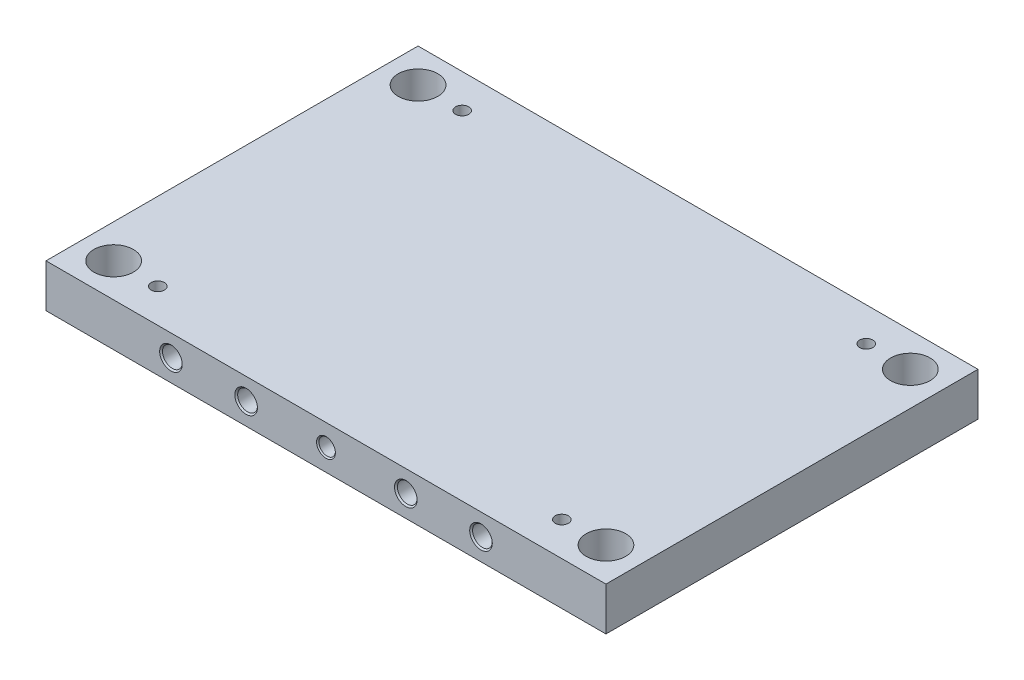
ISO-10303-21;
HEADER;
FILE_DESCRIPTION(('STEP AP214'),'2;1');
FILE_NAME('part.step','',(''),(''),'','','');
FILE_SCHEMA(('AUTOMOTIVE_DESIGN { 1 0 10303 214 1 1 1 1 }'));
ENDSEC;
DATA;
#1=APPLICATION_CONTEXT('core data for automotive mechanical design processes');
#2=APPLICATION_PROTOCOL_DEFINITION('international standard','automotive_design',2000,#1);
#3=PRODUCT_CONTEXT('',#1,'mechanical');
#4=PRODUCT('Part','Part','',(#3));
#5=PRODUCT_RELATED_PRODUCT_CATEGORY('part','',(#4));
#6=PRODUCT_DEFINITION_FORMATION('','',#4);
#7=PRODUCT_DEFINITION_CONTEXT('part definition',#1,'design');
#8=PRODUCT_DEFINITION('design','',#6,#7);
#9=PRODUCT_DEFINITION_SHAPE('','',#8);
#10=(LENGTH_UNIT() NAMED_UNIT(*) SI_UNIT(.MILLI.,.METRE.));
#11=(NAMED_UNIT(*) PLANE_ANGLE_UNIT() SI_UNIT($,.RADIAN.));
#12=(NAMED_UNIT(*) SI_UNIT($,.STERADIAN.) SOLID_ANGLE_UNIT());
#13=UNCERTAINTY_MEASURE_WITH_UNIT(LENGTH_MEASURE(1.E-05),#10,'distance_accuracy_value','');
#14=(GEOMETRIC_REPRESENTATION_CONTEXT(3) GLOBAL_UNCERTAINTY_ASSIGNED_CONTEXT((#13)) GLOBAL_UNIT_ASSIGNED_CONTEXT((#10,
#11,#12)) REPRESENTATION_CONTEXT('',''));
#15=CARTESIAN_POINT('',(0.,0.,0.));
#16=DIRECTION('',(0.,0.,1.));
#17=DIRECTION('',(1.,0.,0.));
#18=AXIS2_PLACEMENT_3D('',#15,#16,#17);
#19=CARTESIAN_POINT('',(0.,-46.,-396.));
#20=DIRECTION('',(0.,0.,1.));
#21=DIRECTION('',(1.,0.,0.));
#22=AXIS2_PLACEMENT_3D('',#19,#20,#21);
#23=PLANE('',#22);
#24=CARTESIAN_POINT('',(133.,-23.,-396.));
#25=DIRECTION('',(0.,0.,-1.));
#26=DIRECTION('',(-1.,0.,0.));
#27=AXIS2_PLACEMENT_3D('',#24,#25,#26);
#28=CIRCLE('',#27,12.025);
#29=CARTESIAN_POINT('',(120.975,-23.,-396.));
#30=VERTEX_POINT('',#29);
#31=EDGE_CURVE('E116',#30,#30,#28,.T.);
#32=ORIENTED_EDGE('',*,*,#31,.F.);
#33=EDGE_LOOP('',(#32));
#34=FACE_BOUND('',#33,.T.);
#35=CARTESIAN_POINT('',(463.,-23.,-396.));
#36=DIRECTION('',(0.,0.,-1.));
#37=DIRECTION('',(-1.,0.,0.));
#38=AXIS2_PLACEMENT_3D('',#35,#36,#37);
#39=CIRCLE('',#38,12.025);
#40=CARTESIAN_POINT('',(450.975,-23.,-396.));
#41=VERTEX_POINT('',#40);
#42=EDGE_CURVE('E136',#41,#41,#39,.T.);
#43=ORIENTED_EDGE('',*,*,#42,.F.);
#44=EDGE_LOOP('',(#43));
#45=FACE_BOUND('',#44,.T.);
#46=DIRECTION('',(1.,0.,0.));
#47=VECTOR('',#46,1.);
#48=CARTESIAN_POINT('',(0.,0.,-396.));
#49=LINE('',#48,#47);
#50=CARTESIAN_POINT('',(0.,0.,-396.));
#51=VERTEX_POINT('',#50);
#52=CARTESIAN_POINT('',(596.,0.,-396.));
#53=VERTEX_POINT('',#52);
#54=EDGE_CURVE('E74',#51,#53,#49,.T.);
#55=ORIENTED_EDGE('',*,*,#54,.T.);
#56=DIRECTION('',(0.,1.,0.));
#57=VECTOR('',#56,1.);
#58=CARTESIAN_POINT('',(596.,-46.,-396.));
#59=LINE('',#58,#57);
#60=CARTESIAN_POINT('',(596.,-46.,-396.));
#61=VERTEX_POINT('',#60);
#62=EDGE_CURVE('E252',#61,#53,#59,.T.);
#63=ORIENTED_EDGE('',*,*,#62,.F.);
#64=DIRECTION('',(1.,0.,0.));
#65=VECTOR('',#64,1.);
#66=CARTESIAN_POINT('',(0.,-46.,-396.));
#67=LINE('',#66,#65);
#68=CARTESIAN_POINT('',(0.,-46.,-396.));
#69=VERTEX_POINT('',#68);
#70=EDGE_CURVE('E219',#69,#61,#67,.T.);
#71=ORIENTED_EDGE('',*,*,#70,.F.);
#72=DIRECTION('',(0.,1.,0.));
#73=VECTOR('',#72,1.);
#74=CARTESIAN_POINT('',(0.,-46.,-396.));
#75=LINE('',#74,#73);
#76=EDGE_CURVE('E48',#69,#51,#75,.T.);
#77=ORIENTED_EDGE('',*,*,#76,.T.);
#78=EDGE_LOOP('',(#55,#63,#71,#77));
#79=FACE_BOUND('',#78,.T.);
#80=CARTESIAN_POINT('',(383.,-23.,-396.));
#81=DIRECTION('',(0.,0.,-1.));
#82=DIRECTION('',(-1.,0.,0.));
#83=AXIS2_PLACEMENT_3D('',#80,#81,#82);
#84=CIRCLE('',#83,12.025);
#85=CARTESIAN_POINT('',(370.975,-23.,-396.));
#86=VERTEX_POINT('',#85);
#87=EDGE_CURVE('E126',#86,#86,#84,.T.);
#88=ORIENTED_EDGE('',*,*,#87,.F.);
#89=EDGE_LOOP('',(#88));
#90=FACE_BOUND('',#89,.T.);
#91=CARTESIAN_POINT('',(213.,-23.,-396.));
#92=DIRECTION('',(0.,0.,-1.));
#93=DIRECTION('',(-1.,0.,0.));
#94=AXIS2_PLACEMENT_3D('',#91,#92,#93);
#95=CIRCLE('',#94,12.025);
#96=CARTESIAN_POINT('',(200.975,-23.,-396.));
#97=VERTEX_POINT('',#96);
#98=EDGE_CURVE('E100',#97,#97,#95,.T.);
#99=ORIENTED_EDGE('',*,*,#98,.F.);
#100=EDGE_LOOP('',(#99));
#101=FACE_BOUND('',#100,.T.);
#102=ADVANCED_FACE('F38',(#34,#45,#79,#90,#101),#23,.F.);
#103=CARTESIAN_POINT('',(0.,-46.,0.));
#104=DIRECTION('',(0.,0.,1.));
#105=DIRECTION('',(1.,0.,0.));
#106=AXIS2_PLACEMENT_3D('',#103,#104,#105);
#107=PLANE('',#106);
#108=CARTESIAN_POINT('',(298.,-23.,0.));
#109=DIRECTION('',(0.,0.,1.));
#110=DIRECTION('',(1.,0.,0.));
#111=AXIS2_PLACEMENT_3D('',#108,#109,#110);
#112=CIRCLE('',#111,10.025);
#113=CARTESIAN_POINT('',(308.025,-23.,0.));
#114=VERTEX_POINT('',#113);
#115=EDGE_CURVE('E107',#114,#114,#112,.T.);
#116=ORIENTED_EDGE('',*,*,#115,.F.);
#117=EDGE_LOOP('',(#116));
#118=FACE_BOUND('',#117,.T.);
#119=CARTESIAN_POINT('',(213.,-23.,0.));
#120=DIRECTION('',(0.,0.,1.));
#121=DIRECTION('',(1.,0.,0.));
#122=AXIS2_PLACEMENT_3D('',#119,#120,#121);
#123=CIRCLE('',#122,12.025);
#124=CARTESIAN_POINT('',(225.025,-23.,0.));
#125=VERTEX_POINT('',#124);
#126=EDGE_CURVE('E146',#125,#125,#123,.T.);
#127=ORIENTED_EDGE('',*,*,#126,.F.);
#128=EDGE_LOOP('',(#127));
#129=FACE_BOUND('',#128,.T.);
#130=CARTESIAN_POINT('',(133.,-23.,0.));
#131=DIRECTION('',(0.,0.,1.));
#132=DIRECTION('',(1.,0.,0.));
#133=AXIS2_PLACEMENT_3D('',#130,#131,#132);
#134=CIRCLE('',#133,12.025);
#135=CARTESIAN_POINT('',(145.025,-23.,0.));
#136=VERTEX_POINT('',#135);
#137=EDGE_CURVE('E156',#136,#136,#134,.T.);
#138=ORIENTED_EDGE('',*,*,#137,.F.);
#139=EDGE_LOOP('',(#138));
#140=FACE_BOUND('',#139,.T.);
#141=CARTESIAN_POINT('',(383.,-23.,0.));
#142=DIRECTION('',(0.,0.,1.));
#143=DIRECTION('',(1.,0.,0.));
#144=AXIS2_PLACEMENT_3D('',#141,#142,#143);
#145=CIRCLE('',#144,12.025);
#146=CARTESIAN_POINT('',(395.025,-23.,0.));
#147=VERTEX_POINT('',#146);
#148=EDGE_CURVE('E166',#147,#147,#145,.T.);
#149=ORIENTED_EDGE('',*,*,#148,.F.);
#150=EDGE_LOOP('',(#149));
#151=FACE_BOUND('',#150,.T.);
#152=CARTESIAN_POINT('',(463.,-23.,0.));
#153=DIRECTION('',(0.,0.,1.));
#154=DIRECTION('',(1.,0.,0.));
#155=AXIS2_PLACEMENT_3D('',#152,#153,#154);
#156=CIRCLE('',#155,12.025);
#157=CARTESIAN_POINT('',(475.025,-23.,0.));
#158=VERTEX_POINT('',#157);
#159=EDGE_CURVE('E176',#158,#158,#156,.T.);
#160=ORIENTED_EDGE('',*,*,#159,.F.);
#161=EDGE_LOOP('',(#160));
#162=FACE_BOUND('',#161,.T.);
#163=DIRECTION('',(1.,0.,0.));
#164=VECTOR('',#163,1.);
#165=CARTESIAN_POINT('',(0.,0.,0.));
#166=LINE('',#165,#164);
#167=CARTESIAN_POINT('',(0.,0.,0.));
#168=VERTEX_POINT('',#167);
#169=CARTESIAN_POINT('',(596.,0.,0.));
#170=VERTEX_POINT('',#169);
#171=EDGE_CURVE('E235',#168,#170,#166,.T.);
#172=ORIENTED_EDGE('',*,*,#171,.F.);
#173=DIRECTION('',(0.,1.,0.));
#174=VECTOR('',#173,1.);
#175=CARTESIAN_POINT('',(0.,-46.,0.));
#176=LINE('',#175,#174);
#177=CARTESIAN_POINT('',(0.,-46.,0.));
#178=VERTEX_POINT('',#177);
#179=EDGE_CURVE('E11',#178,#168,#176,.T.);
#180=ORIENTED_EDGE('',*,*,#179,.F.);
#181=DIRECTION('',(1.,0.,0.));
#182=VECTOR('',#181,1.);
#183=CARTESIAN_POINT('',(0.,-46.,0.));
#184=LINE('',#183,#182);
#185=CARTESIAN_POINT('',(596.,-46.,0.));
#186=VERTEX_POINT('',#185);
#187=EDGE_CURVE('E214',#178,#186,#184,.T.);
#188=ORIENTED_EDGE('',*,*,#187,.T.);
#189=DIRECTION('',(0.,1.,0.));
#190=VECTOR('',#189,1.);
#191=CARTESIAN_POINT('',(596.,-46.,0.));
#192=LINE('',#191,#190);
#193=EDGE_CURVE('E84',#186,#170,#192,.T.);
#194=ORIENTED_EDGE('',*,*,#193,.T.);
#195=EDGE_LOOP('',(#172,#180,#188,#194));
#196=FACE_BOUND('',#195,.T.);
#197=ADVANCED_FACE('F289',(#118,#129,#140,#151,#162,#196),#107,.T.);
#198=CARTESIAN_POINT('',(0.,-46.,0.));
#199=DIRECTION('',(1.,0.,0.));
#200=DIRECTION('',(0.,0.,-1.));
#201=AXIS2_PLACEMENT_3D('',#198,#199,#200);
#202=PLANE('',#201);
#203=DIRECTION('',(0.,0.,-1.));
#204=VECTOR('',#203,1.);
#205=CARTESIAN_POINT('',(0.,0.,0.));
#206=LINE('',#205,#204);
#207=EDGE_CURVE('E241',#168,#51,#206,.T.);
#208=ORIENTED_EDGE('',*,*,#207,.T.);
#209=ORIENTED_EDGE('',*,*,#76,.F.);
#210=DIRECTION('',(0.,0.,-1.));
#211=VECTOR('',#210,1.);
#212=CARTESIAN_POINT('',(0.,-46.,0.));
#213=LINE('',#212,#211);
#214=EDGE_CURVE('E221',#178,#69,#213,.T.);
#215=ORIENTED_EDGE('',*,*,#214,.F.);
#216=ORIENTED_EDGE('',*,*,#179,.T.);
#217=EDGE_LOOP('',(#208,#209,#215,#216));
#218=FACE_BOUND('',#217,.T.);
#219=ADVANCED_FACE('F295',(#218),#202,.F.);
#220=CARTESIAN_POINT('',(35.9999999999999,-46.,-360.));
#221=DIRECTION('',(0.,1.,0.));
#222=DIRECTION('',(0.,0.,1.));
#223=AXIS2_PLACEMENT_3D('',#220,#221,#222);
#224=CYLINDRICAL_SURFACE('',#223,21.);
#225=CARTESIAN_POINT('',(35.9999999999999,-46.,-360.));
#226=DIRECTION('',(0.,1.,0.));
#227=DIRECTION('',(0.,0.,1.));
#228=AXIS2_PLACEMENT_3D('',#225,#226,#227);
#229=CIRCLE('',#228,21.);
#230=CARTESIAN_POINT('',(35.9999999999999,-46.,-339.));
#231=VERTEX_POINT('',#230);
#232=EDGE_CURVE('E227',#231,#231,#229,.T.);
#233=ORIENTED_EDGE('',*,*,#232,.F.);
#234=EDGE_LOOP('',(#233));
#235=FACE_BOUND('',#234,.T.);
#236=CARTESIAN_POINT('',(35.9999999999999,0.,-360.));
#237=DIRECTION('',(0.,1.,0.));
#238=DIRECTION('',(0.,0.,1.));
#239=AXIS2_PLACEMENT_3D('',#236,#237,#238);
#240=CIRCLE('',#239,21.);
#241=CARTESIAN_POINT('',(35.9999999999999,0.,-339.));
#242=VERTEX_POINT('',#241);
#243=EDGE_CURVE('E246',#242,#242,#240,.T.);
#244=ORIENTED_EDGE('',*,*,#243,.T.);
#245=EDGE_LOOP('',(#244));
#246=FACE_BOUND('',#245,.T.);
#247=ADVANCED_FACE('F311',(#235,#246),#224,.F.);
#248=CARTESIAN_POINT('',(560.,-46.,-36.));
#249=DIRECTION('',(0.,1.,0.));
#250=DIRECTION('',(0.,0.,1.));
#251=AXIS2_PLACEMENT_3D('',#248,#249,#250);
#252=CYLINDRICAL_SURFACE('',#251,21.);
#253=CARTESIAN_POINT('',(560.,-46.,-36.));
#254=DIRECTION('',(0.,1.,0.));
#255=DIRECTION('',(0.,0.,1.));
#256=AXIS2_PLACEMENT_3D('',#253,#254,#255);
#257=CIRCLE('',#256,21.);
#258=CARTESIAN_POINT('',(560.,-46.,-15.));
#259=VERTEX_POINT('',#258);
#260=EDGE_CURVE('E224',#259,#259,#257,.T.);
#261=ORIENTED_EDGE('',*,*,#260,.F.);
#262=EDGE_LOOP('',(#261));
#263=FACE_BOUND('',#262,.T.);
#264=CARTESIAN_POINT('',(560.,0.,-36.));
#265=DIRECTION('',(0.,1.,0.));
#266=DIRECTION('',(0.,0.,1.));
#267=AXIS2_PLACEMENT_3D('',#264,#265,#266);
#268=CIRCLE('',#267,21.);
#269=CARTESIAN_POINT('',(560.,0.,-15.));
#270=VERTEX_POINT('',#269);
#271=EDGE_CURVE('E243',#270,#270,#268,.T.);
#272=ORIENTED_EDGE('',*,*,#271,.T.);
#273=EDGE_LOOP('',(#272));
#274=FACE_BOUND('',#273,.T.);
#275=ADVANCED_FACE('F304',(#263,#274),#252,.F.);
#276=CARTESIAN_POINT('',(596.,-46.,0.));
#277=DIRECTION('',(1.,0.,0.));
#278=DIRECTION('',(0.,0.,-1.));
#279=AXIS2_PLACEMENT_3D('',#276,#277,#278);
#280=PLANE('',#279);
#281=DIRECTION('',(0.,0.,-1.));
#282=VECTOR('',#281,1.);
#283=CARTESIAN_POINT('',(596.,0.,0.));
#284=LINE('',#283,#282);
#285=EDGE_CURVE('E238',#170,#53,#284,.T.);
#286=ORIENTED_EDGE('',*,*,#285,.F.);
#287=ORIENTED_EDGE('',*,*,#193,.F.);
#288=DIRECTION('',(0.,0.,-1.));
#289=VECTOR('',#288,1.);
#290=CARTESIAN_POINT('',(596.,-46.,0.));
#291=LINE('',#290,#289);
#292=EDGE_CURVE('E217',#186,#61,#291,.T.);
#293=ORIENTED_EDGE('',*,*,#292,.T.);
#294=ORIENTED_EDGE('',*,*,#62,.T.);
#295=EDGE_LOOP('',(#286,#287,#293,#294));
#296=FACE_BOUND('',#295,.T.);
#297=ADVANCED_FACE('F302',(#296),#280,.T.);
#298=CARTESIAN_POINT('',(35.9999999999999,-46.,-36.));
#299=DIRECTION('',(0.,1.,0.));
#300=DIRECTION('',(0.,0.,1.));
#301=AXIS2_PLACEMENT_3D('',#298,#299,#300);
#302=CYLINDRICAL_SURFACE('',#301,21.);
#303=CARTESIAN_POINT('',(35.9999999999999,-46.,-36.));
#304=DIRECTION('',(0.,1.,0.));
#305=DIRECTION('',(0.,0.,1.));
#306=AXIS2_PLACEMENT_3D('',#303,#304,#305);
#307=CIRCLE('',#306,21.);
#308=CARTESIAN_POINT('',(35.9999999999999,-46.,-15.));
#309=VERTEX_POINT('',#308);
#310=EDGE_CURVE('E211',#309,#309,#307,.F.);
#311=ORIENTED_EDGE('',*,*,#310,.T.);
#312=EDGE_LOOP('',(#311));
#313=FACE_BOUND('',#312,.T.);
#314=CARTESIAN_POINT('',(35.9999999999999,0.,-36.));
#315=DIRECTION('',(0.,1.,0.));
#316=DIRECTION('',(0.,0.,1.));
#317=AXIS2_PLACEMENT_3D('',#314,#315,#316);
#318=CIRCLE('',#317,21.);
#319=CARTESIAN_POINT('',(35.9999999999999,0.,-15.));
#320=VERTEX_POINT('',#319);
#321=EDGE_CURVE('E210',#320,#320,#318,.F.);
#322=ORIENTED_EDGE('',*,*,#321,.F.);
#323=EDGE_LOOP('',(#322));
#324=FACE_BOUND('',#323,.T.);
#325=ADVANCED_FACE('F40',(#313,#324),#302,.F.);
#326=CARTESIAN_POINT('',(560.,-46.,-360.));
#327=DIRECTION('',(0.,1.,0.));
#328=DIRECTION('',(0.,0.,1.));
#329=AXIS2_PLACEMENT_3D('',#326,#327,#328);
#330=CYLINDRICAL_SURFACE('',#329,21.);
#331=CARTESIAN_POINT('',(560.,-46.,-360.));
#332=DIRECTION('',(0.,1.,0.));
#333=DIRECTION('',(0.,0.,1.));
#334=AXIS2_PLACEMENT_3D('',#331,#332,#333);
#335=CIRCLE('',#334,21.);
#336=CARTESIAN_POINT('',(560.,-46.,-339.));
#337=VERTEX_POINT('',#336);
#338=EDGE_CURVE('E230',#337,#337,#335,.F.);
#339=ORIENTED_EDGE('',*,*,#338,.T.);
#340=EDGE_LOOP('',(#339));
#341=FACE_BOUND('',#340,.T.);
#342=CARTESIAN_POINT('',(560.,0.,-360.));
#343=DIRECTION('',(0.,1.,0.));
#344=DIRECTION('',(0.,0.,1.));
#345=AXIS2_PLACEMENT_3D('',#342,#343,#344);
#346=CIRCLE('',#345,21.);
#347=CARTESIAN_POINT('',(560.,0.,-339.));
#348=VERTEX_POINT('',#347);
#349=EDGE_CURVE('E215',#348,#348,#346,.F.);
#350=ORIENTED_EDGE('',*,*,#349,.F.);
#351=EDGE_LOOP('',(#350));
#352=FACE_BOUND('',#351,.T.);
#353=ADVANCED_FACE('F309',(#341,#352),#330,.F.);
#354=CARTESIAN_POINT('',(0.,-46.,0.));
#355=DIRECTION('',(0.,1.,0.));
#356=DIRECTION('',(0.,0.,1.));
#357=AXIS2_PLACEMENT_3D('',#354,#355,#356);
#358=PLANE('',#357);
#359=CARTESIAN_POINT('',(83.,-46.,-360.));
#360=DIRECTION('',(0.,1.,0.));
#361=DIRECTION('',(0.,0.,1.));
#362=AXIS2_PLACEMENT_3D('',#359,#360,#361);
#363=CIRCLE('',#362,6.99999999999999);
#364=CARTESIAN_POINT('',(83.,-46.,-353.));
#365=VERTEX_POINT('',#364);
#366=EDGE_CURVE('E189',#365,#365,#363,.T.);
#367=ORIENTED_EDGE('',*,*,#366,.T.);
#368=EDGE_LOOP('',(#367));
#369=FACE_BOUND('',#368,.T.);
#370=CARTESIAN_POINT('',(513.,-46.,-360.));
#371=DIRECTION('',(0.,1.,0.));
#372=DIRECTION('',(0.,0.,1.));
#373=AXIS2_PLACEMENT_3D('',#370,#371,#372);
#374=CIRCLE('',#373,7.00000000000001);
#375=CARTESIAN_POINT('',(513.,-46.,-353.));
#376=VERTEX_POINT('',#375);
#377=EDGE_CURVE('E195',#376,#376,#374,.T.);
#378=ORIENTED_EDGE('',*,*,#377,.T.);
#379=EDGE_LOOP('',(#378));
#380=FACE_BOUND('',#379,.T.);
#381=CARTESIAN_POINT('',(83.,-46.,-36.));
#382=DIRECTION('',(0.,1.,0.));
#383=DIRECTION('',(0.,0.,1.));
#384=AXIS2_PLACEMENT_3D('',#381,#382,#383);
#385=CIRCLE('',#384,6.99999999999999);
#386=CARTESIAN_POINT('',(83.,-46.,-29.));
#387=VERTEX_POINT('',#386);
#388=EDGE_CURVE('E201',#387,#387,#385,.T.);
#389=ORIENTED_EDGE('',*,*,#388,.T.);
#390=EDGE_LOOP('',(#389));
#391=FACE_BOUND('',#390,.T.);
#392=CARTESIAN_POINT('',(513.,-46.,-36.));
#393=DIRECTION('',(0.,1.,0.));
#394=DIRECTION('',(0.,0.,1.));
#395=AXIS2_PLACEMENT_3D('',#392,#393,#394);
#396=CIRCLE('',#395,7.00000000000001);
#397=CARTESIAN_POINT('',(513.,-46.,-29.));
#398=VERTEX_POINT('',#397);
#399=EDGE_CURVE('E207',#398,#398,#396,.T.);
#400=ORIENTED_EDGE('',*,*,#399,.T.);
#401=EDGE_LOOP('',(#400));
#402=FACE_BOUND('',#401,.T.);
#403=ORIENTED_EDGE('',*,*,#310,.F.);
#404=EDGE_LOOP('',(#403));
#405=FACE_BOUND('',#404,.T.);
#406=ORIENTED_EDGE('',*,*,#187,.F.);
#407=ORIENTED_EDGE('',*,*,#214,.T.);
#408=ORIENTED_EDGE('',*,*,#70,.T.);
#409=ORIENTED_EDGE('',*,*,#292,.F.);
#410=EDGE_LOOP('',(#406,#407,#408,#409));
#411=FACE_BOUND('',#410,.T.);
#412=ORIENTED_EDGE('',*,*,#260,.T.);
#413=EDGE_LOOP('',(#412));
#414=FACE_BOUND('',#413,.T.);
#415=ORIENTED_EDGE('',*,*,#232,.T.);
#416=EDGE_LOOP('',(#415));
#417=FACE_BOUND('',#416,.T.);
#418=ORIENTED_EDGE('',*,*,#338,.F.);
#419=EDGE_LOOP('',(#418));
#420=FACE_BOUND('',#419,.T.);
#421=ADVANCED_FACE('F318',(#369,#380,#391,#402,#405,#411,#414,#417,#420),#358,.F.);
#422=CARTESIAN_POINT('',(0.,0.,0.));
#423=DIRECTION('',(0.,1.,0.));
#424=DIRECTION('',(0.,0.,1.));
#425=AXIS2_PLACEMENT_3D('',#422,#423,#424);
#426=PLANE('',#425);
#427=CARTESIAN_POINT('',(83.,0.,-360.));
#428=DIRECTION('',(0.,1.,0.));
#429=DIRECTION('',(0.,0.,1.));
#430=AXIS2_PLACEMENT_3D('',#427,#428,#429);
#431=CIRCLE('',#430,6.99999999999999);
#432=CARTESIAN_POINT('',(83.,0.,-353.));
#433=VERTEX_POINT('',#432);
#434=EDGE_CURVE('E186',#433,#433,#431,.T.);
#435=ORIENTED_EDGE('',*,*,#434,.F.);
#436=EDGE_LOOP('',(#435));
#437=FACE_BOUND('',#436,.T.);
#438=CARTESIAN_POINT('',(513.,0.,-360.));
#439=DIRECTION('',(0.,1.,0.));
#440=DIRECTION('',(0.,0.,1.));
#441=AXIS2_PLACEMENT_3D('',#438,#439,#440);
#442=CIRCLE('',#441,7.00000000000001);
#443=CARTESIAN_POINT('',(513.,0.,-353.));
#444=VERTEX_POINT('',#443);
#445=EDGE_CURVE('E192',#444,#444,#442,.T.);
#446=ORIENTED_EDGE('',*,*,#445,.F.);
#447=EDGE_LOOP('',(#446));
#448=FACE_BOUND('',#447,.T.);
#449=CARTESIAN_POINT('',(83.,0.,-36.));
#450=DIRECTION('',(0.,1.,0.));
#451=DIRECTION('',(0.,0.,1.));
#452=AXIS2_PLACEMENT_3D('',#449,#450,#451);
#453=CIRCLE('',#452,6.99999999999999);
#454=CARTESIAN_POINT('',(83.,0.,-29.));
#455=VERTEX_POINT('',#454);
#456=EDGE_CURVE('E198',#455,#455,#453,.T.);
#457=ORIENTED_EDGE('',*,*,#456,.F.);
#458=EDGE_LOOP('',(#457));
#459=FACE_BOUND('',#458,.T.);
#460=CARTESIAN_POINT('',(513.,0.,-36.));
#461=DIRECTION('',(0.,1.,0.));
#462=DIRECTION('',(0.,0.,1.));
#463=AXIS2_PLACEMENT_3D('',#460,#461,#462);
#464=CIRCLE('',#463,7.00000000000001);
#465=CARTESIAN_POINT('',(513.,0.,-29.));
#466=VERTEX_POINT('',#465);
#467=EDGE_CURVE('E204',#466,#466,#464,.T.);
#468=ORIENTED_EDGE('',*,*,#467,.F.);
#469=EDGE_LOOP('',(#468));
#470=FACE_BOUND('',#469,.T.);
#471=ORIENTED_EDGE('',*,*,#321,.T.);
#472=EDGE_LOOP('',(#471));
#473=FACE_BOUND('',#472,.T.);
#474=ORIENTED_EDGE('',*,*,#171,.T.);
#475=ORIENTED_EDGE('',*,*,#285,.T.);
#476=ORIENTED_EDGE('',*,*,#54,.F.);
#477=ORIENTED_EDGE('',*,*,#207,.F.);
#478=EDGE_LOOP('',(#474,#475,#476,#477));
#479=FACE_BOUND('',#478,.T.);
#480=ORIENTED_EDGE('',*,*,#271,.F.);
#481=EDGE_LOOP('',(#480));
#482=FACE_BOUND('',#481,.T.);
#483=ORIENTED_EDGE('',*,*,#243,.F.);
#484=EDGE_LOOP('',(#483));
#485=FACE_BOUND('',#484,.T.);
#486=ORIENTED_EDGE('',*,*,#349,.T.);
#487=EDGE_LOOP('',(#486));
#488=FACE_BOUND('',#487,.T.);
#489=ADVANCED_FACE('F314',(#437,#448,#459,#470,#473,#479,#482,#485,#488),#426,.T.);
#490=CARTESIAN_POINT('',(513.,0.,-36.));
#491=DIRECTION('',(0.,1.,0.));
#492=DIRECTION('',(0.,0.,1.));
#493=AXIS2_PLACEMENT_3D('',#490,#491,#492);
#494=CYLINDRICAL_SURFACE('',#493,7.00000000000001);
#495=ORIENTED_EDGE('',*,*,#399,.F.);
#496=EDGE_LOOP('',(#495));
#497=FACE_BOUND('',#496,.T.);
#498=ORIENTED_EDGE('',*,*,#467,.T.);
#499=EDGE_LOOP('',(#498));
#500=FACE_BOUND('',#499,.T.);
#501=ADVANCED_FACE('F339',(#497,#500),#494,.F.);
#502=CARTESIAN_POINT('',(83.,0.,-36.));
#503=DIRECTION('',(0.,1.,0.));
#504=DIRECTION('',(0.,0.,1.));
#505=AXIS2_PLACEMENT_3D('',#502,#503,#504);
#506=CYLINDRICAL_SURFACE('',#505,6.99999999999999);
#507=ORIENTED_EDGE('',*,*,#388,.F.);
#508=EDGE_LOOP('',(#507));
#509=FACE_BOUND('',#508,.T.);
#510=ORIENTED_EDGE('',*,*,#456,.T.);
#511=EDGE_LOOP('',(#510));
#512=FACE_BOUND('',#511,.T.);
#513=ADVANCED_FACE('F346',(#509,#512),#506,.F.);
#514=CARTESIAN_POINT('',(513.,0.,-360.));
#515=DIRECTION('',(0.,1.,0.));
#516=DIRECTION('',(0.,0.,1.));
#517=AXIS2_PLACEMENT_3D('',#514,#515,#516);
#518=CYLINDRICAL_SURFACE('',#517,7.00000000000001);
#519=ORIENTED_EDGE('',*,*,#377,.F.);
#520=EDGE_LOOP('',(#519));
#521=FACE_BOUND('',#520,.T.);
#522=ORIENTED_EDGE('',*,*,#445,.T.);
#523=EDGE_LOOP('',(#522));
#524=FACE_BOUND('',#523,.T.);
#525=ADVANCED_FACE('F350',(#521,#524),#518,.F.);
#526=CARTESIAN_POINT('',(83.,0.,-360.));
#527=DIRECTION('',(0.,1.,0.));
#528=DIRECTION('',(0.,0.,1.));
#529=AXIS2_PLACEMENT_3D('',#526,#527,#528);
#530=CYLINDRICAL_SURFACE('',#529,6.99999999999999);
#531=ORIENTED_EDGE('',*,*,#366,.F.);
#532=EDGE_LOOP('',(#531));
#533=FACE_BOUND('',#532,.T.);
#534=ORIENTED_EDGE('',*,*,#434,.T.);
#535=EDGE_LOOP('',(#534));
#536=FACE_BOUND('',#535,.T.);
#537=ADVANCED_FACE('F354',(#533,#536),#530,.F.);
#538=CARTESIAN_POINT('',(133.,-23.,-396.));
#539=DIRECTION('',(0.,0.,1.));
#540=DIRECTION('',(1.,0.,0.));
#541=AXIS2_PLACEMENT_3D('',#538,#539,#540);
#542=CYLINDRICAL_SURFACE('',#541,5.00000000000002);
#543=CARTESIAN_POINT('',(133.,-23.,-357.695266595348));
#544=DIRECTION('',(0.,0.,-1.));
#545=DIRECTION('',(-1.,0.,0.));
#546=AXIS2_PLACEMENT_3D('',#543,#544,#545);
#547=CIRCLE('',#546,5.00000000000002);
#548=CARTESIAN_POINT('',(128.,-23.,-357.695266595348));
#549=VERTEX_POINT('',#548);
#550=EDGE_CURVE('E125',#549,#549,#547,.T.);
#551=ORIENTED_EDGE('',*,*,#550,.T.);
#552=EDGE_LOOP('',(#551));
#553=FACE_BOUND('',#552,.T.);
#554=CARTESIAN_POINT('',(133.,-23.,-38.3047334046516));
#555=DIRECTION('',(0.,0.,1.));
#556=DIRECTION('',(1.,0.,0.));
#557=AXIS2_PLACEMENT_3D('',#554,#555,#556);
#558=CIRCLE('',#557,5.00000000000002);
#559=CARTESIAN_POINT('',(138.,-23.,-38.3047334046516));
#560=VERTEX_POINT('',#559);
#561=EDGE_CURVE('E165',#560,#560,#558,.T.);
#562=ORIENTED_EDGE('',*,*,#561,.T.);
#563=EDGE_LOOP('',(#562));
#564=FACE_BOUND('',#563,.T.);
#565=ADVANCED_FACE('F269',(#553,#564),#542,.F.);
#566=CARTESIAN_POINT('',(213.,-23.,-396.));
#567=DIRECTION('',(0.,0.,1.));
#568=DIRECTION('',(1.,0.,0.));
#569=AXIS2_PLACEMENT_3D('',#566,#567,#568);
#570=CYLINDRICAL_SURFACE('',#569,4.99999999999999);
#571=CARTESIAN_POINT('',(213.,-23.,-357.695266595348));
#572=DIRECTION('',(0.,0.,-1.));
#573=DIRECTION('',(-1.,0.,0.));
#574=AXIS2_PLACEMENT_3D('',#571,#572,#573);
#575=CIRCLE('',#574,4.99999999999999);
#576=CARTESIAN_POINT('',(208.,-23.,-357.695266595348));
#577=VERTEX_POINT('',#576);
#578=EDGE_CURVE('E42',#577,#577,#575,.T.);
#579=ORIENTED_EDGE('',*,*,#578,.T.);
#580=EDGE_LOOP('',(#579));
#581=FACE_BOUND('',#580,.T.);
#582=CARTESIAN_POINT('',(213.,-23.,-38.3047334046516));
#583=DIRECTION('',(0.,0.,1.));
#584=DIRECTION('',(1.,0.,0.));
#585=AXIS2_PLACEMENT_3D('',#582,#583,#584);
#586=CIRCLE('',#585,4.99999999999999);
#587=CARTESIAN_POINT('',(218.,-23.,-38.3047334046516));
#588=VERTEX_POINT('',#587);
#589=EDGE_CURVE('E155',#588,#588,#586,.T.);
#590=ORIENTED_EDGE('',*,*,#589,.T.);
#591=EDGE_LOOP('',(#590));
#592=FACE_BOUND('',#591,.T.);
#593=ADVANCED_FACE('F361',(#581,#592),#570,.F.);
#594=CARTESIAN_POINT('',(463.,-23.,-396.));
#595=DIRECTION('',(0.,0.,1.));
#596=DIRECTION('',(1.,0.,0.));
#597=AXIS2_PLACEMENT_3D('',#594,#595,#596);
#598=CYLINDRICAL_SURFACE('',#597,4.99999999999999);
#599=CARTESIAN_POINT('',(463.,-23.,-357.695266595348));
#600=DIRECTION('',(0.,0.,-1.));
#601=DIRECTION('',(-1.,0.,0.));
#602=AXIS2_PLACEMENT_3D('',#599,#600,#601);
#603=CIRCLE('',#602,4.99999999999999);
#604=CARTESIAN_POINT('',(458.,-23.,-357.695266595348));
#605=VERTEX_POINT('',#604);
#606=EDGE_CURVE('E145',#605,#605,#603,.T.);
#607=ORIENTED_EDGE('',*,*,#606,.T.);
#608=EDGE_LOOP('',(#607));
#609=FACE_BOUND('',#608,.T.);
#610=CARTESIAN_POINT('',(463.,-23.,-38.3047334046516));
#611=DIRECTION('',(0.,0.,1.));
#612=DIRECTION('',(1.,0.,0.));
#613=AXIS2_PLACEMENT_3D('',#610,#611,#612);
#614=CIRCLE('',#613,4.99999999999999);
#615=CARTESIAN_POINT('',(468.,-23.,-38.3047334046516));
#616=VERTEX_POINT('',#615);
#617=EDGE_CURVE('E185',#616,#616,#614,.T.);
#618=ORIENTED_EDGE('',*,*,#617,.T.);
#619=EDGE_LOOP('',(#618));
#620=FACE_BOUND('',#619,.T.);
#621=ADVANCED_FACE('F364',(#609,#620),#598,.F.);
#622=CARTESIAN_POINT('',(383.,-23.,-396.));
#623=DIRECTION('',(0.,0.,1.));
#624=DIRECTION('',(1.,0.,0.));
#625=AXIS2_PLACEMENT_3D('',#622,#623,#624);
#626=CYLINDRICAL_SURFACE('',#625,4.99999999999999);
#627=CARTESIAN_POINT('',(383.,-23.,-357.695266595348));
#628=DIRECTION('',(0.,0.,-1.));
#629=DIRECTION('',(-1.,0.,0.));
#630=AXIS2_PLACEMENT_3D('',#627,#628,#629);
#631=CIRCLE('',#630,4.99999999999999);
#632=CARTESIAN_POINT('',(378.,-23.,-357.695266595348));
#633=VERTEX_POINT('',#632);
#634=EDGE_CURVE('E135',#633,#633,#631,.T.);
#635=ORIENTED_EDGE('',*,*,#634,.T.);
#636=EDGE_LOOP('',(#635));
#637=FACE_BOUND('',#636,.T.);
#638=CARTESIAN_POINT('',(383.,-23.,-38.3047334046516));
#639=DIRECTION('',(0.,0.,1.));
#640=DIRECTION('',(1.,0.,0.));
#641=AXIS2_PLACEMENT_3D('',#638,#639,#640);
#642=CIRCLE('',#641,4.99999999999999);
#643=CARTESIAN_POINT('',(388.,-23.,-38.3047334046516));
#644=VERTEX_POINT('',#643);
#645=EDGE_CURVE('E175',#644,#644,#642,.T.);
#646=ORIENTED_EDGE('',*,*,#645,.T.);
#647=EDGE_LOOP('',(#646));
#648=FACE_BOUND('',#647,.T.);
#649=ADVANCED_FACE('F368',(#637,#648),#626,.F.);
#650=CARTESIAN_POINT('',(463.,-23.,-35.));
#651=DIRECTION('',(0.,0.,1.));
#652=DIRECTION('',(1.,0.,0.));
#653=AXIS2_PLACEMENT_3D('',#650,#651,#652);
#654=CONICAL_SURFACE('',#653,10.5,1.02974425867665);
#655=CARTESIAN_POINT('',(463.,-23.,-35.));
#656=DIRECTION('',(0.,0.,1.));
#657=DIRECTION('',(1.,0.,0.));
#658=AXIS2_PLACEMENT_3D('',#655,#656,#657);
#659=CIRCLE('',#658,10.5);
#660=CARTESIAN_POINT('',(473.5,-23.,-35.));
#661=VERTEX_POINT('',#660);
#662=EDGE_CURVE('E182',#661,#661,#659,.T.);
#663=ORIENTED_EDGE('',*,*,#662,.T.);
#664=EDGE_LOOP('',(#663));
#665=FACE_BOUND('',#664,.T.);
#666=ORIENTED_EDGE('',*,*,#617,.F.);
#667=EDGE_LOOP('',(#666));
#668=FACE_BOUND('',#667,.T.);
#669=ADVANCED_FACE('F372',(#665,#668),#654,.F.);
#670=CARTESIAN_POINT('',(463.,-23.,0.));
#671=DIRECTION('',(0.,0.,1.));
#672=DIRECTION('',(1.,0.,0.));
#673=AXIS2_PLACEMENT_3D('',#670,#671,#672);
#674=CYLINDRICAL_SURFACE('',#673,10.5);
#675=ORIENTED_EDGE('',*,*,#662,.F.);
#676=EDGE_LOOP('',(#675));
#677=FACE_BOUND('',#676,.T.);
#678=CARTESIAN_POINT('',(463.,-23.,-1.52500000000001));
#679=DIRECTION('',(0.,0.,1.));
#680=DIRECTION('',(1.,0.,0.));
#681=AXIS2_PLACEMENT_3D('',#678,#679,#680);
#682=CIRCLE('',#681,10.5);
#683=CARTESIAN_POINT('',(473.5,-23.,-1.52500000000001));
#684=VERTEX_POINT('',#683);
#685=EDGE_CURVE('E179',#684,#684,#682,.T.);
#686=ORIENTED_EDGE('',*,*,#685,.T.);
#687=EDGE_LOOP('',(#686));
#688=FACE_BOUND('',#687,.T.);
#689=ADVANCED_FACE('F376',(#677,#688),#674,.F.);
#690=CARTESIAN_POINT('',(463.,-23.,0.));
#691=DIRECTION('',(0.,0.,1.));
#692=DIRECTION('',(1.,0.,0.));
#693=AXIS2_PLACEMENT_3D('',#690,#691,#692);
#694=CONICAL_SURFACE('',#693,12.025,0.785398163397446);
#695=ORIENTED_EDGE('',*,*,#685,.F.);
#696=EDGE_LOOP('',(#695));
#697=FACE_BOUND('',#696,.T.);
#698=ORIENTED_EDGE('',*,*,#159,.T.);
#699=EDGE_LOOP('',(#698));
#700=FACE_BOUND('',#699,.T.);
#701=ADVANCED_FACE('F380',(#697,#700),#694,.F.);
#702=CARTESIAN_POINT('',(383.,-23.,-35.));
#703=DIRECTION('',(0.,0.,1.));
#704=DIRECTION('',(1.,0.,0.));
#705=AXIS2_PLACEMENT_3D('',#702,#703,#704);
#706=CONICAL_SURFACE('',#705,10.5,1.02974425867665);
#707=CARTESIAN_POINT('',(383.,-23.,-35.));
#708=DIRECTION('',(0.,0.,1.));
#709=DIRECTION('',(1.,0.,0.));
#710=AXIS2_PLACEMENT_3D('',#707,#708,#709);
#711=CIRCLE('',#710,10.5);
#712=CARTESIAN_POINT('',(393.5,-23.,-35.));
#713=VERTEX_POINT('',#712);
#714=EDGE_CURVE('E172',#713,#713,#711,.T.);
#715=ORIENTED_EDGE('',*,*,#714,.T.);
#716=EDGE_LOOP('',(#715));
#717=FACE_BOUND('',#716,.T.);
#718=ORIENTED_EDGE('',*,*,#645,.F.);
#719=EDGE_LOOP('',(#718));
#720=FACE_BOUND('',#719,.T.);
#721=ADVANCED_FACE('F384',(#717,#720),#706,.F.);
#722=CARTESIAN_POINT('',(383.,-23.,0.));
#723=DIRECTION('',(0.,0.,1.));
#724=DIRECTION('',(1.,0.,0.));
#725=AXIS2_PLACEMENT_3D('',#722,#723,#724);
#726=CYLINDRICAL_SURFACE('',#725,10.5);
#727=ORIENTED_EDGE('',*,*,#714,.F.);
#728=EDGE_LOOP('',(#727));
#729=FACE_BOUND('',#728,.T.);
#730=CARTESIAN_POINT('',(383.,-23.,-1.52500000000001));
#731=DIRECTION('',(0.,0.,1.));
#732=DIRECTION('',(1.,0.,0.));
#733=AXIS2_PLACEMENT_3D('',#730,#731,#732);
#734=CIRCLE('',#733,10.5);
#735=CARTESIAN_POINT('',(393.5,-23.,-1.52500000000001));
#736=VERTEX_POINT('',#735);
#737=EDGE_CURVE('E169',#736,#736,#734,.T.);
#738=ORIENTED_EDGE('',*,*,#737,.T.);
#739=EDGE_LOOP('',(#738));
#740=FACE_BOUND('',#739,.T.);
#741=ADVANCED_FACE('F388',(#729,#740),#726,.F.);
#742=CARTESIAN_POINT('',(383.,-23.,0.));
#743=DIRECTION('',(0.,0.,1.));
#744=DIRECTION('',(1.,0.,0.));
#745=AXIS2_PLACEMENT_3D('',#742,#743,#744);
#746=CONICAL_SURFACE('',#745,12.025,0.785398163397446);
#747=ORIENTED_EDGE('',*,*,#737,.F.);
#748=EDGE_LOOP('',(#747));
#749=FACE_BOUND('',#748,.T.);
#750=ORIENTED_EDGE('',*,*,#148,.T.);
#751=EDGE_LOOP('',(#750));
#752=FACE_BOUND('',#751,.T.);
#753=ADVANCED_FACE('F392',(#749,#752),#746,.F.);
#754=CARTESIAN_POINT('',(133.,-23.,-35.));
#755=DIRECTION('',(0.,0.,1.));
#756=DIRECTION('',(1.,0.,0.));
#757=AXIS2_PLACEMENT_3D('',#754,#755,#756);
#758=CONICAL_SURFACE('',#757,10.5,1.02974425867665);
#759=CARTESIAN_POINT('',(133.,-23.,-35.));
#760=DIRECTION('',(0.,0.,1.));
#761=DIRECTION('',(1.,0.,0.));
#762=AXIS2_PLACEMENT_3D('',#759,#760,#761);
#763=CIRCLE('',#762,10.5);
#764=CARTESIAN_POINT('',(143.5,-23.,-35.));
#765=VERTEX_POINT('',#764);
#766=EDGE_CURVE('E162',#765,#765,#763,.T.);
#767=ORIENTED_EDGE('',*,*,#766,.T.);
#768=EDGE_LOOP('',(#767));
#769=FACE_BOUND('',#768,.T.);
#770=ORIENTED_EDGE('',*,*,#561,.F.);
#771=EDGE_LOOP('',(#770));
#772=FACE_BOUND('',#771,.T.);
#773=ADVANCED_FACE('F396',(#769,#772),#758,.F.);
#774=CARTESIAN_POINT('',(133.,-23.,0.));
#775=DIRECTION('',(0.,0.,1.));
#776=DIRECTION('',(1.,0.,0.));
#777=AXIS2_PLACEMENT_3D('',#774,#775,#776);
#778=CYLINDRICAL_SURFACE('',#777,10.5);
#779=ORIENTED_EDGE('',*,*,#766,.F.);
#780=EDGE_LOOP('',(#779));
#781=FACE_BOUND('',#780,.T.);
#782=CARTESIAN_POINT('',(133.,-23.,-1.52500000000001));
#783=DIRECTION('',(0.,0.,1.));
#784=DIRECTION('',(1.,0.,0.));
#785=AXIS2_PLACEMENT_3D('',#782,#783,#784);
#786=CIRCLE('',#785,10.5);
#787=CARTESIAN_POINT('',(143.5,-23.,-1.52500000000001));
#788=VERTEX_POINT('',#787);
#789=EDGE_CURVE('E159',#788,#788,#786,.T.);
#790=ORIENTED_EDGE('',*,*,#789,.T.);
#791=EDGE_LOOP('',(#790));
#792=FACE_BOUND('',#791,.T.);
#793=ADVANCED_FACE('F400',(#781,#792),#778,.F.);
#794=CARTESIAN_POINT('',(133.,-23.,0.));
#795=DIRECTION('',(0.,0.,1.));
#796=DIRECTION('',(1.,0.,0.));
#797=AXIS2_PLACEMENT_3D('',#794,#795,#796);
#798=CONICAL_SURFACE('',#797,12.025,0.785398163397455);
#799=ORIENTED_EDGE('',*,*,#789,.F.);
#800=EDGE_LOOP('',(#799));
#801=FACE_BOUND('',#800,.T.);
#802=ORIENTED_EDGE('',*,*,#137,.T.);
#803=EDGE_LOOP('',(#802));
#804=FACE_BOUND('',#803,.T.);
#805=ADVANCED_FACE('F404',(#801,#804),#798,.F.);
#806=CARTESIAN_POINT('',(213.,-23.,-35.));
#807=DIRECTION('',(0.,0.,1.));
#808=DIRECTION('',(1.,0.,0.));
#809=AXIS2_PLACEMENT_3D('',#806,#807,#808);
#810=CONICAL_SURFACE('',#809,10.5,1.02974425867665);
#811=CARTESIAN_POINT('',(213.,-23.,-35.));
#812=DIRECTION('',(0.,0.,1.));
#813=DIRECTION('',(1.,0.,0.));
#814=AXIS2_PLACEMENT_3D('',#811,#812,#813);
#815=CIRCLE('',#814,10.5);
#816=CARTESIAN_POINT('',(223.5,-23.,-35.));
#817=VERTEX_POINT('',#816);
#818=EDGE_CURVE('E152',#817,#817,#815,.T.);
#819=ORIENTED_EDGE('',*,*,#818,.T.);
#820=EDGE_LOOP('',(#819));
#821=FACE_BOUND('',#820,.T.);
#822=ORIENTED_EDGE('',*,*,#589,.F.);
#823=EDGE_LOOP('',(#822));
#824=FACE_BOUND('',#823,.T.);
#825=ADVANCED_FACE('F408',(#821,#824),#810,.F.);
#826=CARTESIAN_POINT('',(213.,-23.,0.));
#827=DIRECTION('',(0.,0.,1.));
#828=DIRECTION('',(1.,0.,0.));
#829=AXIS2_PLACEMENT_3D('',#826,#827,#828);
#830=CYLINDRICAL_SURFACE('',#829,10.5);
#831=ORIENTED_EDGE('',*,*,#818,.F.);
#832=EDGE_LOOP('',(#831));
#833=FACE_BOUND('',#832,.T.);
#834=CARTESIAN_POINT('',(213.,-23.,-1.52500000000001));
#835=DIRECTION('',(0.,0.,1.));
#836=DIRECTION('',(1.,0.,0.));
#837=AXIS2_PLACEMENT_3D('',#834,#835,#836);
#838=CIRCLE('',#837,10.5);
#839=CARTESIAN_POINT('',(223.5,-23.,-1.52500000000001));
#840=VERTEX_POINT('',#839);
#841=EDGE_CURVE('E149',#840,#840,#838,.T.);
#842=ORIENTED_EDGE('',*,*,#841,.T.);
#843=EDGE_LOOP('',(#842));
#844=FACE_BOUND('',#843,.T.);
#845=ADVANCED_FACE('F412',(#833,#844),#830,.F.);
#846=CARTESIAN_POINT('',(213.,-23.,0.));
#847=DIRECTION('',(0.,0.,1.));
#848=DIRECTION('',(1.,0.,0.));
#849=AXIS2_PLACEMENT_3D('',#846,#847,#848);
#850=CONICAL_SURFACE('',#849,12.025,0.785398163397455);
#851=ORIENTED_EDGE('',*,*,#841,.F.);
#852=EDGE_LOOP('',(#851));
#853=FACE_BOUND('',#852,.T.);
#854=ORIENTED_EDGE('',*,*,#126,.T.);
#855=EDGE_LOOP('',(#854));
#856=FACE_BOUND('',#855,.T.);
#857=ADVANCED_FACE('F416',(#853,#856),#850,.F.);
#858=CARTESIAN_POINT('',(463.,-23.,-361.));
#859=DIRECTION('',(0.,0.,-1.));
#860=DIRECTION('',(-1.,0.,0.));
#861=AXIS2_PLACEMENT_3D('',#858,#859,#860);
#862=CONICAL_SURFACE('',#861,10.5,1.02974425867666);
#863=CARTESIAN_POINT('',(463.,-23.,-361.));
#864=DIRECTION('',(0.,0.,-1.));
#865=DIRECTION('',(-1.,0.,0.));
#866=AXIS2_PLACEMENT_3D('',#863,#864,#865);
#867=CIRCLE('',#866,10.5);
#868=CARTESIAN_POINT('',(452.5,-23.,-361.));
#869=VERTEX_POINT('',#868);
#870=EDGE_CURVE('E142',#869,#869,#867,.T.);
#871=ORIENTED_EDGE('',*,*,#870,.T.);
#872=EDGE_LOOP('',(#871));
#873=FACE_BOUND('',#872,.T.);
#874=ORIENTED_EDGE('',*,*,#606,.F.);
#875=EDGE_LOOP('',(#874));
#876=FACE_BOUND('',#875,.T.);
#877=ADVANCED_FACE('F420',(#873,#876),#862,.F.);
#878=CARTESIAN_POINT('',(463.,-23.,-396.));
#879=DIRECTION('',(0.,0.,-1.));
#880=DIRECTION('',(-1.,0.,0.));
#881=AXIS2_PLACEMENT_3D('',#878,#879,#880);
#882=CYLINDRICAL_SURFACE('',#881,10.5);
#883=ORIENTED_EDGE('',*,*,#870,.F.);
#884=EDGE_LOOP('',(#883));
#885=FACE_BOUND('',#884,.T.);
#886=CARTESIAN_POINT('',(463.,-23.,-394.475));
#887=DIRECTION('',(0.,0.,-1.));
#888=DIRECTION('',(-1.,0.,0.));
#889=AXIS2_PLACEMENT_3D('',#886,#887,#888);
#890=CIRCLE('',#889,10.5);
#891=CARTESIAN_POINT('',(452.5,-23.,-394.475));
#892=VERTEX_POINT('',#891);
#893=EDGE_CURVE('E139',#892,#892,#890,.T.);
#894=ORIENTED_EDGE('',*,*,#893,.T.);
#895=EDGE_LOOP('',(#894));
#896=FACE_BOUND('',#895,.T.);
#897=ADVANCED_FACE('F424',(#885,#896),#882,.F.);
#898=CARTESIAN_POINT('',(463.,-23.,-396.));
#899=DIRECTION('',(0.,0.,-1.));
#900=DIRECTION('',(-1.,0.,0.));
#901=AXIS2_PLACEMENT_3D('',#898,#899,#900);
#902=CONICAL_SURFACE('',#901,12.025,0.785398163397448);
#903=ORIENTED_EDGE('',*,*,#893,.F.);
#904=EDGE_LOOP('',(#903));
#905=FACE_BOUND('',#904,.T.);
#906=ORIENTED_EDGE('',*,*,#42,.T.);
#907=EDGE_LOOP('',(#906));
#908=FACE_BOUND('',#907,.T.);
#909=ADVANCED_FACE('F428',(#905,#908),#902,.F.);
#910=CARTESIAN_POINT('',(383.,-23.,-361.));
#911=DIRECTION('',(0.,0.,-1.));
#912=DIRECTION('',(-1.,0.,0.));
#913=AXIS2_PLACEMENT_3D('',#910,#911,#912);
#914=CONICAL_SURFACE('',#913,10.5,1.02974425867666);
#915=CARTESIAN_POINT('',(383.,-23.,-361.));
#916=DIRECTION('',(0.,0.,-1.));
#917=DIRECTION('',(-1.,0.,0.));
#918=AXIS2_PLACEMENT_3D('',#915,#916,#917);
#919=CIRCLE('',#918,10.5);
#920=CARTESIAN_POINT('',(372.5,-23.,-361.));
#921=VERTEX_POINT('',#920);
#922=EDGE_CURVE('E132',#921,#921,#919,.T.);
#923=ORIENTED_EDGE('',*,*,#922,.T.);
#924=EDGE_LOOP('',(#923));
#925=FACE_BOUND('',#924,.T.);
#926=ORIENTED_EDGE('',*,*,#634,.F.);
#927=EDGE_LOOP('',(#926));
#928=FACE_BOUND('',#927,.T.);
#929=ADVANCED_FACE('F432',(#925,#928),#914,.F.);
#930=CARTESIAN_POINT('',(383.,-23.,-396.));
#931=DIRECTION('',(0.,0.,-1.));
#932=DIRECTION('',(-1.,0.,0.));
#933=AXIS2_PLACEMENT_3D('',#930,#931,#932);
#934=CYLINDRICAL_SURFACE('',#933,10.5);
#935=ORIENTED_EDGE('',*,*,#922,.F.);
#936=EDGE_LOOP('',(#935));
#937=FACE_BOUND('',#936,.T.);
#938=CARTESIAN_POINT('',(383.,-23.,-394.475));
#939=DIRECTION('',(0.,0.,-1.));
#940=DIRECTION('',(-1.,0.,0.));
#941=AXIS2_PLACEMENT_3D('',#938,#939,#940);
#942=CIRCLE('',#941,10.5);
#943=CARTESIAN_POINT('',(372.5,-23.,-394.475));
#944=VERTEX_POINT('',#943);
#945=EDGE_CURVE('E129',#944,#944,#942,.T.);
#946=ORIENTED_EDGE('',*,*,#945,.T.);
#947=EDGE_LOOP('',(#946));
#948=FACE_BOUND('',#947,.T.);
#949=ADVANCED_FACE('F285',(#937,#948),#934,.F.);
#950=CARTESIAN_POINT('',(383.,-23.,-396.));
#951=DIRECTION('',(0.,0.,-1.));
#952=DIRECTION('',(-1.,0.,0.));
#953=AXIS2_PLACEMENT_3D('',#950,#951,#952);
#954=CONICAL_SURFACE('',#953,12.025,0.785398163397448);
#955=ORIENTED_EDGE('',*,*,#945,.F.);
#956=EDGE_LOOP('',(#955));
#957=FACE_BOUND('',#956,.T.);
#958=ORIENTED_EDGE('',*,*,#87,.T.);
#959=EDGE_LOOP('',(#958));
#960=FACE_BOUND('',#959,.T.);
#961=ADVANCED_FACE('F275',(#957,#960),#954,.F.);
#962=CARTESIAN_POINT('',(133.,-23.,-361.));
#963=DIRECTION('',(0.,0.,-1.));
#964=DIRECTION('',(-1.,0.,0.));
#965=AXIS2_PLACEMENT_3D('',#962,#963,#964);
#966=CONICAL_SURFACE('',#965,10.5,1.02974425867665);
#967=CARTESIAN_POINT('',(133.,-23.,-361.));
#968=DIRECTION('',(0.,0.,-1.));
#969=DIRECTION('',(-1.,0.,0.));
#970=AXIS2_PLACEMENT_3D('',#967,#968,#969);
#971=CIRCLE('',#970,10.5);
#972=CARTESIAN_POINT('',(122.5,-23.,-361.));
#973=VERTEX_POINT('',#972);
#974=EDGE_CURVE('E122',#973,#973,#971,.T.);
#975=ORIENTED_EDGE('',*,*,#974,.T.);
#976=EDGE_LOOP('',(#975));
#977=FACE_BOUND('',#976,.T.);
#978=ORIENTED_EDGE('',*,*,#550,.F.);
#979=EDGE_LOOP('',(#978));
#980=FACE_BOUND('',#979,.T.);
#981=ADVANCED_FACE('F272',(#977,#980),#966,.F.);
#982=CARTESIAN_POINT('',(133.,-23.,-396.));
#983=DIRECTION('',(0.,0.,-1.));
#984=DIRECTION('',(-1.,0.,0.));
#985=AXIS2_PLACEMENT_3D('',#982,#983,#984);
#986=CYLINDRICAL_SURFACE('',#985,10.5);
#987=ORIENTED_EDGE('',*,*,#974,.F.);
#988=EDGE_LOOP('',(#987));
#989=FACE_BOUND('',#988,.T.);
#990=CARTESIAN_POINT('',(133.,-23.,-394.475));
#991=DIRECTION('',(0.,0.,-1.));
#992=DIRECTION('',(-1.,0.,0.));
#993=AXIS2_PLACEMENT_3D('',#990,#991,#992);
#994=CIRCLE('',#993,10.5);
#995=CARTESIAN_POINT('',(122.5,-23.,-394.475));
#996=VERTEX_POINT('',#995);
#997=EDGE_CURVE('E119',#996,#996,#994,.T.);
#998=ORIENTED_EDGE('',*,*,#997,.T.);
#999=EDGE_LOOP('',(#998));
#1000=FACE_BOUND('',#999,.T.);
#1001=ADVANCED_FACE('F274',(#989,#1000),#986,.F.);
#1002=CARTESIAN_POINT('',(133.,-23.,-396.));
#1003=DIRECTION('',(0.,0.,-1.));
#1004=DIRECTION('',(-1.,0.,0.));
#1005=AXIS2_PLACEMENT_3D('',#1002,#1003,#1004);
#1006=CONICAL_SURFACE('',#1005,12.025,0.785398163397457);
#1007=ORIENTED_EDGE('',*,*,#997,.F.);
#1008=EDGE_LOOP('',(#1007));
#1009=FACE_BOUND('',#1008,.T.);
#1010=ORIENTED_EDGE('',*,*,#31,.T.);
#1011=EDGE_LOOP('',(#1010));
#1012=FACE_BOUND('',#1011,.T.);
#1013=ADVANCED_FACE('F282',(#1009,#1012),#1006,.F.);
#1014=CARTESIAN_POINT('',(213.,-23.,-361.));
#1015=DIRECTION('',(0.,0.,-1.));
#1016=DIRECTION('',(-1.,0.,0.));
#1017=AXIS2_PLACEMENT_3D('',#1014,#1015,#1016);
#1018=CONICAL_SURFACE('',#1017,10.5,1.02974425867665);
#1019=CARTESIAN_POINT('',(213.,-23.,-361.));
#1020=DIRECTION('',(0.,0.,-1.));
#1021=DIRECTION('',(-1.,0.,0.));
#1022=AXIS2_PLACEMENT_3D('',#1019,#1020,#1021);
#1023=CIRCLE('',#1022,10.5);
#1024=CARTESIAN_POINT('',(202.5,-23.,-361.));
#1025=VERTEX_POINT('',#1024);
#1026=EDGE_CURVE('E113',#1025,#1025,#1023,.T.);
#1027=ORIENTED_EDGE('',*,*,#1026,.T.);
#1028=EDGE_LOOP('',(#1027));
#1029=FACE_BOUND('',#1028,.T.);
#1030=ORIENTED_EDGE('',*,*,#578,.F.);
#1031=EDGE_LOOP('',(#1030));
#1032=FACE_BOUND('',#1031,.T.);
#1033=ADVANCED_FACE('F456',(#1029,#1032),#1018,.F.);
#1034=CARTESIAN_POINT('',(213.,-23.,-396.));
#1035=DIRECTION('',(0.,0.,-1.));
#1036=DIRECTION('',(-1.,0.,0.));
#1037=AXIS2_PLACEMENT_3D('',#1034,#1035,#1036);
#1038=CYLINDRICAL_SURFACE('',#1037,10.5);
#1039=ORIENTED_EDGE('',*,*,#1026,.F.);
#1040=EDGE_LOOP('',(#1039));
#1041=FACE_BOUND('',#1040,.T.);
#1042=CARTESIAN_POINT('',(213.,-23.,-394.475));
#1043=DIRECTION('',(0.,0.,-1.));
#1044=DIRECTION('',(-1.,0.,0.));
#1045=AXIS2_PLACEMENT_3D('',#1042,#1043,#1044);
#1046=CIRCLE('',#1045,10.5);
#1047=CARTESIAN_POINT('',(202.5,-23.,-394.475));
#1048=VERTEX_POINT('',#1047);
#1049=EDGE_CURVE('E104',#1048,#1048,#1046,.T.);
#1050=ORIENTED_EDGE('',*,*,#1049,.T.);
#1051=EDGE_LOOP('',(#1050));
#1052=FACE_BOUND('',#1051,.T.);
#1053=ADVANCED_FACE('F450',(#1041,#1052),#1038,.F.);
#1054=CARTESIAN_POINT('',(213.,-23.,-396.));
#1055=DIRECTION('',(0.,0.,-1.));
#1056=DIRECTION('',(-1.,0.,0.));
#1057=AXIS2_PLACEMENT_3D('',#1054,#1055,#1056);
#1058=CONICAL_SURFACE('',#1057,12.025,0.785398163397457);
#1059=ORIENTED_EDGE('',*,*,#1049,.F.);
#1060=EDGE_LOOP('',(#1059));
#1061=FACE_BOUND('',#1060,.T.);
#1062=ORIENTED_EDGE('',*,*,#98,.T.);
#1063=EDGE_LOOP('',(#1062));
#1064=FACE_BOUND('',#1063,.T.);
#1065=ADVANCED_FACE('F94',(#1061,#1064),#1058,.F.);
#1066=CARTESIAN_POINT('',(298.,-23.,-52.5));
#1067=DIRECTION('',(0.,0.,1.));
#1068=DIRECTION('',(1.,0.,0.));
#1069=AXIS2_PLACEMENT_3D('',#1066,#1067,#1068);
#1070=CONICAL_SURFACE('',#1069,8.74999999999998,1.02974425867665);
#1071=CARTESIAN_POINT('',(298.,-23.,-57.7575304164912));
#1072=VERTEX_POINT('',#1071);
#1073=VERTEX_LOOP('',#1072);
#1074=FACE_BOUND('',#1073,.T.);
#1075=CARTESIAN_POINT('',(298.,-23.,-52.5));
#1076=DIRECTION('',(0.,0.,1.));
#1077=DIRECTION('',(1.,0.,0.));
#1078=AXIS2_PLACEMENT_3D('',#1075,#1076,#1077);
#1079=CIRCLE('',#1078,8.74999999999998);
#1080=CARTESIAN_POINT('',(306.75,-23.,-52.5));
#1081=VERTEX_POINT('',#1080);
#1082=EDGE_CURVE('E98',#1081,#1081,#1079,.T.);
#1083=ORIENTED_EDGE('',*,*,#1082,.T.);
#1084=EDGE_LOOP('',(#1083));
#1085=FACE_BOUND('',#1084,.T.);
#1086=ADVANCED_FACE('F90',(#1074,#1085),#1070,.F.);
#1087=CARTESIAN_POINT('',(298.,-23.,0.));
#1088=DIRECTION('',(0.,0.,1.));
#1089=DIRECTION('',(1.,0.,0.));
#1090=AXIS2_PLACEMENT_3D('',#1087,#1088,#1089);
#1091=CYLINDRICAL_SURFACE('',#1090,8.74999999999998);
#1092=ORIENTED_EDGE('',*,*,#1082,.F.);
#1093=EDGE_LOOP('',(#1092));
#1094=FACE_BOUND('',#1093,.T.);
#1095=CARTESIAN_POINT('',(298.,-23.,-1.27500000000001));
#1096=DIRECTION('',(0.,0.,1.));
#1097=DIRECTION('',(1.,0.,0.));
#1098=AXIS2_PLACEMENT_3D('',#1095,#1096,#1097);
#1099=CIRCLE('',#1098,8.74999999999998);
#1100=CARTESIAN_POINT('',(306.75,-23.,-1.27500000000001));
#1101=VERTEX_POINT('',#1100);
#1102=EDGE_CURVE('E101',#1101,#1101,#1099,.T.);
#1103=ORIENTED_EDGE('',*,*,#1102,.T.);
#1104=EDGE_LOOP('',(#1103));
#1105=FACE_BOUND('',#1104,.T.);
#1106=ADVANCED_FACE('F93',(#1094,#1105),#1091,.F.);
#1107=CARTESIAN_POINT('',(298.,-23.,0.));
#1108=DIRECTION('',(0.,0.,1.));
#1109=DIRECTION('',(1.,0.,0.));
#1110=AXIS2_PLACEMENT_3D('',#1107,#1108,#1109);
#1111=CONICAL_SURFACE('',#1110,10.025,0.785398163397456);
#1112=ORIENTED_EDGE('',*,*,#1102,.F.);
#1113=EDGE_LOOP('',(#1112));
#1114=FACE_BOUND('',#1113,.T.);
#1115=ORIENTED_EDGE('',*,*,#115,.T.);
#1116=EDGE_LOOP('',(#1115));
#1117=FACE_BOUND('',#1116,.T.);
#1118=ADVANCED_FACE('F513',(#1114,#1117),#1111,.F.);
#1119=CLOSED_SHELL('',(#102,#197,#219,#247,#275,#297,#325,#353,#421,#489,#501,#513,#525,#537,
#565,#593,#621,#649,#669,#689,#701,#721,#741,#753,#773,#793,#805,#825,#845,#857,#877,#897,#909,
#929,#949,#961,#981,#1001,#1013,#1033,#1053,#1065,#1086,#1106,#1118));
#1120=MANIFOLD_SOLID_BREP('B2',#1119);
#1121=ADVANCED_BREP_SHAPE_REPRESENTATION('',(#18,#1120),#14);
#1122=SHAPE_DEFINITION_REPRESENTATION(#9,#1121);
ENDSEC;
END-ISO-10303-21;
